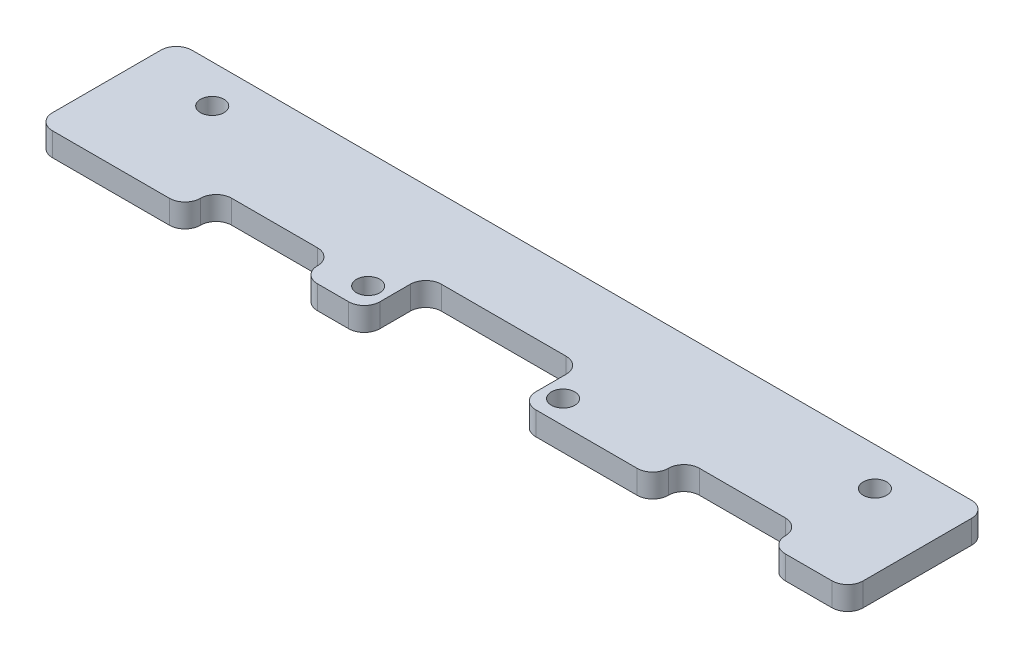
ISO-10303-21;
HEADER;
FILE_DESCRIPTION(('STEP AP214'),'2;1');
FILE_NAME('part.step','',(''),(''),'','','');
FILE_SCHEMA(('AUTOMOTIVE_DESIGN { 1 0 10303 214 1 1 1 1 }'));
ENDSEC;
DATA;
#1=APPLICATION_CONTEXT('core data for automotive mechanical design processes');
#2=APPLICATION_PROTOCOL_DEFINITION('international standard','automotive_design',2000,#1);
#3=PRODUCT_CONTEXT('',#1,'mechanical');
#4=PRODUCT('Part','Part','',(#3));
#5=PRODUCT_RELATED_PRODUCT_CATEGORY('part','',(#4));
#6=PRODUCT_DEFINITION_FORMATION('','',#4);
#7=PRODUCT_DEFINITION_CONTEXT('part definition',#1,'design');
#8=PRODUCT_DEFINITION('design','',#6,#7);
#9=PRODUCT_DEFINITION_SHAPE('','',#8);
#10=(LENGTH_UNIT() NAMED_UNIT(*) SI_UNIT(.MILLI.,.METRE.));
#11=(NAMED_UNIT(*) PLANE_ANGLE_UNIT() SI_UNIT($,.RADIAN.));
#12=(NAMED_UNIT(*) SI_UNIT($,.STERADIAN.) SOLID_ANGLE_UNIT());
#13=UNCERTAINTY_MEASURE_WITH_UNIT(LENGTH_MEASURE(1.E-05),#10,'distance_accuracy_value','');
#14=(GEOMETRIC_REPRESENTATION_CONTEXT(3) GLOBAL_UNCERTAINTY_ASSIGNED_CONTEXT((#13)) GLOBAL_UNIT_ASSIGNED_CONTEXT((#10,
#11,#12)) REPRESENTATION_CONTEXT('',''));
#15=CARTESIAN_POINT('',(0.,0.,0.));
#16=DIRECTION('',(0.,0.,1.));
#17=DIRECTION('',(1.,0.,0.));
#18=AXIS2_PLACEMENT_3D('',#15,#16,#17);
#19=CARTESIAN_POINT('',(-52.,3.,17.9));
#20=DIRECTION('',(0.,0.,-1.));
#21=DIRECTION('',(-1.,0.,0.));
#22=AXIS2_PLACEMENT_3D('',#19,#20,#21);
#23=PLANE('',#22);
#24=DIRECTION('',(1.,0.,0.));
#25=VECTOR('',#24,1.);
#26=CARTESIAN_POINT('',(-52.,0.,17.9));
#27=LINE('',#26,#25);
#28=CARTESIAN_POINT('',(-50.,0.,17.9));
#29=VERTEX_POINT('',#28);
#30=CARTESIAN_POINT('',(-35.,0.,17.9));
#31=VERTEX_POINT('',#30);
#32=EDGE_CURVE('E328',#29,#31,#27,.T.);
#33=ORIENTED_EDGE('',*,*,#32,.T.);
#34=DIRECTION('',(0.,1.,0.));
#35=VECTOR('',#34,1.);
#36=CARTESIAN_POINT('',(-35.,3.,17.9));
#37=LINE('',#36,#35);
#38=CARTESIAN_POINT('',(-35.,3.,17.9));
#39=VERTEX_POINT('',#38);
#40=EDGE_CURVE('E404',#31,#39,#37,.T.);
#41=ORIENTED_EDGE('',*,*,#40,.T.);
#42=DIRECTION('',(1.,0.,0.));
#43=VECTOR('',#42,1.);
#44=CARTESIAN_POINT('',(-52.,3.,17.9));
#45=LINE('',#44,#43);
#46=CARTESIAN_POINT('',(-50.,3.,17.9));
#47=VERTEX_POINT('',#46);
#48=EDGE_CURVE('E306',#47,#39,#45,.T.);
#49=ORIENTED_EDGE('',*,*,#48,.F.);
#50=DIRECTION('',(0.,-1.,0.));
#51=VECTOR('',#50,1.);
#52=CARTESIAN_POINT('',(-50.,3.,17.9));
#53=LINE('',#52,#51);
#54=EDGE_CURVE('E401',#47,#29,#53,.T.);
#55=ORIENTED_EDGE('',*,*,#54,.T.);
#56=EDGE_LOOP('',(#33,#41,#49,#55));
#57=FACE_BOUND('',#56,.T.);
#58=ADVANCED_FACE('F44',(#57),#23,.F.);
#59=CARTESIAN_POINT('',(52.,3.,17.9));
#60=DIRECTION('',(0.,0.,-1.));
#61=DIRECTION('',(-1.,0.,0.));
#62=AXIS2_PLACEMENT_3D('',#59,#60,#61);
#63=PLANE('',#62);
#64=DIRECTION('',(1.,0.,0.));
#65=VECTOR('',#64,1.);
#66=CARTESIAN_POINT('',(52.,0.,17.9));
#67=LINE('',#66,#65);
#68=CARTESIAN_POINT('',(12.,0.,17.9));
#69=VERTEX_POINT('',#68);
#70=CARTESIAN_POINT('',(25.,0.,17.9));
#71=VERTEX_POINT('',#70);
#72=EDGE_CURVE('E297',#69,#71,#67,.T.);
#73=ORIENTED_EDGE('',*,*,#72,.T.);
#74=DIRECTION('',(0.,1.,0.));
#75=VECTOR('',#74,1.);
#76=CARTESIAN_POINT('',(25.,3.,17.9));
#77=LINE('',#76,#75);
#78=CARTESIAN_POINT('',(25.,3.,17.9));
#79=VERTEX_POINT('',#78);
#80=EDGE_CURVE('E389',#71,#79,#77,.T.);
#81=ORIENTED_EDGE('',*,*,#80,.T.);
#82=DIRECTION('',(1.,0.,0.));
#83=VECTOR('',#82,1.);
#84=CARTESIAN_POINT('',(52.,3.,17.9));
#85=LINE('',#84,#83);
#86=CARTESIAN_POINT('',(12.,3.,17.9));
#87=VERTEX_POINT('',#86);
#88=EDGE_CURVE('E252',#87,#79,#85,.T.);
#89=ORIENTED_EDGE('',*,*,#88,.F.);
#90=DIRECTION('',(0.,-1.,0.));
#91=VECTOR('',#90,1.);
#92=CARTESIAN_POINT('',(12.,3.,17.9));
#93=LINE('',#92,#91);
#94=EDGE_CURVE('E386',#87,#69,#93,.T.);
#95=ORIENTED_EDGE('',*,*,#94,.T.);
#96=EDGE_LOOP('',(#73,#81,#89,#95));
#97=FACE_BOUND('',#96,.T.);
#98=ADVANCED_FACE('F532',(#97),#63,.F.);
#99=CARTESIAN_POINT('',(0.,3.,0.));
#100=DIRECTION('',(0.,-1.,0.));
#101=DIRECTION('',(0.,0.,-1.));
#102=AXIS2_PLACEMENT_3D('',#99,#100,#101);
#103=PLANE('',#102);
#104=DIRECTION('',(-1.,0.,0.));
#105=VECTOR('',#104,1.);
#106=CARTESIAN_POINT('',(-33.,3.,13.9));
#107=LINE('',#106,#105);
#108=CARTESIAN_POINT('',(-20.,3.,13.9));
#109=VERTEX_POINT('',#108);
#110=CARTESIAN_POINT('',(-31.,3.,13.9));
#111=VERTEX_POINT('',#110);
#112=EDGE_CURVE('E247',#109,#111,#107,.T.);
#113=ORIENTED_EDGE('',*,*,#112,.F.);
#114=CARTESIAN_POINT('',(-20.,3.,15.9));
#115=DIRECTION('',(0.,-1.,0.));
#116=DIRECTION('',(0.,0.,-1.));
#117=AXIS2_PLACEMENT_3D('',#114,#115,#116);
#118=CIRCLE('',#117,2.);
#119=CARTESIAN_POINT('',(-18.,3.,15.9));
#120=VERTEX_POINT('',#119);
#121=EDGE_CURVE('E230',#109,#120,#118,.T.);
#122=ORIENTED_EDGE('',*,*,#121,.T.);
#123=CARTESIAN_POINT('',(-16.,3.,15.9));
#124=DIRECTION('',(0.,-1.,0.));
#125=DIRECTION('',(0.,0.,-1.));
#126=AXIS2_PLACEMENT_3D('',#123,#124,#125);
#127=CIRCLE('',#126,2.);
#128=CARTESIAN_POINT('',(-16.,3.,17.9));
#129=VERTEX_POINT('',#128);
#130=EDGE_CURVE('E361',#120,#129,#127,.F.);
#131=ORIENTED_EDGE('',*,*,#130,.T.);
#132=CARTESIAN_POINT('',(-12.,3.,17.9));
#133=VERTEX_POINT('',#132);
#134=EDGE_CURVE('E303',#129,#133,#45,.T.);
#135=ORIENTED_EDGE('',*,*,#134,.T.);
#136=CARTESIAN_POINT('',(-12.,3.,15.9));
#137=DIRECTION('',(0.,-1.,0.));
#138=DIRECTION('',(0.,0.,-1.));
#139=AXIS2_PLACEMENT_3D('',#136,#137,#138);
#140=CIRCLE('',#139,2.);
#141=CARTESIAN_POINT('',(-10.,3.,15.9));
#142=VERTEX_POINT('',#141);
#143=EDGE_CURVE('E349',#133,#142,#140,.F.);
#144=ORIENTED_EDGE('',*,*,#143,.T.);
#145=DIRECTION('',(0.,0.,-1.));
#146=VECTOR('',#145,1.);
#147=CARTESIAN_POINT('',(-10.,3.,17.9));
#148=LINE('',#147,#146);
#149=CARTESIAN_POINT('',(-10.,3.,12.));
#150=VERTEX_POINT('',#149);
#151=EDGE_CURVE('E307',#142,#150,#148,.T.);
#152=ORIENTED_EDGE('',*,*,#151,.T.);
#153=CARTESIAN_POINT('',(-8.,3.,12.));
#154=DIRECTION('',(0.,-1.,0.));
#155=DIRECTION('',(0.,0.,-1.));
#156=AXIS2_PLACEMENT_3D('',#153,#154,#155);
#157=CIRCLE('',#156,2.);
#158=CARTESIAN_POINT('',(-8.,3.,10.));
#159=VERTEX_POINT('',#158);
#160=EDGE_CURVE('E11',#150,#159,#157,.T.);
#161=ORIENTED_EDGE('',*,*,#160,.T.);
#162=DIRECTION('',(1.,0.,0.));
#163=VECTOR('',#162,1.);
#164=CARTESIAN_POINT('',(10.,3.,10.));
#165=LINE('',#164,#163);
#166=CARTESIAN_POINT('',(8.,3.,10.));
#167=VERTEX_POINT('',#166);
#168=EDGE_CURVE('E310',#159,#167,#165,.T.);
#169=ORIENTED_EDGE('',*,*,#168,.T.);
#170=CARTESIAN_POINT('',(8.,3.,12.));
#171=DIRECTION('',(0.,-1.,0.));
#172=DIRECTION('',(0.,0.,-1.));
#173=AXIS2_PLACEMENT_3D('',#170,#171,#172);
#174=CIRCLE('',#173,2.);
#175=CARTESIAN_POINT('',(10.,3.,12.));
#176=VERTEX_POINT('',#175);
#177=EDGE_CURVE('E449',#167,#176,#174,.T.);
#178=ORIENTED_EDGE('',*,*,#177,.T.);
#179=DIRECTION('',(0.,0.,1.));
#180=VECTOR('',#179,1.);
#181=CARTESIAN_POINT('',(10.,3.,17.9));
#182=LINE('',#181,#180);
#183=CARTESIAN_POINT('',(10.,3.,15.9));
#184=VERTEX_POINT('',#183);
#185=EDGE_CURVE('E313',#176,#184,#182,.T.);
#186=ORIENTED_EDGE('',*,*,#185,.T.);
#187=CARTESIAN_POINT('',(12.,3.,15.9));
#188=DIRECTION('',(0.,-1.,0.));
#189=DIRECTION('',(0.,0.,-1.));
#190=AXIS2_PLACEMENT_3D('',#187,#188,#189);
#191=CIRCLE('',#190,2.);
#192=EDGE_CURVE('E351',#184,#87,#191,.F.);
#193=ORIENTED_EDGE('',*,*,#192,.T.);
#194=ORIENTED_EDGE('',*,*,#88,.T.);
#195=CARTESIAN_POINT('',(25.,3.,15.9));
#196=DIRECTION('',(0.,-1.,0.));
#197=DIRECTION('',(0.,0.,-1.));
#198=AXIS2_PLACEMENT_3D('',#195,#196,#197);
#199=CIRCLE('',#198,2.);
#200=CARTESIAN_POINT('',(27.,3.,15.9));
#201=VERTEX_POINT('',#200);
#202=EDGE_CURVE('E359',#79,#201,#199,.F.);
#203=ORIENTED_EDGE('',*,*,#202,.T.);
#204=CARTESIAN_POINT('',(29.,3.,15.9));
#205=DIRECTION('',(0.,-1.,0.));
#206=DIRECTION('',(0.,0.,-1.));
#207=AXIS2_PLACEMENT_3D('',#204,#205,#206);
#208=CIRCLE('',#207,2.);
#209=CARTESIAN_POINT('',(29.,3.,13.9));
#210=VERTEX_POINT('',#209);
#211=EDGE_CURVE('E439',#201,#210,#208,.T.);
#212=ORIENTED_EDGE('',*,*,#211,.T.);
#213=DIRECTION('',(-1.,0.,0.));
#214=VECTOR('',#213,1.);
#215=CARTESIAN_POINT('',(42.,3.,13.9));
#216=LINE('',#215,#214);
#217=CARTESIAN_POINT('',(40.,3.,13.9));
#218=VERTEX_POINT('',#217);
#219=EDGE_CURVE('E258',#218,#210,#216,.T.);
#220=ORIENTED_EDGE('',*,*,#219,.F.);
#221=CARTESIAN_POINT('',(40.,3.,15.9));
#222=DIRECTION('',(0.,-1.,0.));
#223=DIRECTION('',(0.,0.,-1.));
#224=AXIS2_PLACEMENT_3D('',#221,#222,#223);
#225=CIRCLE('',#224,2.);
#226=CARTESIAN_POINT('',(42.,3.,15.9));
#227=VERTEX_POINT('',#226);
#228=EDGE_CURVE('E443',#218,#227,#225,.T.);
#229=ORIENTED_EDGE('',*,*,#228,.T.);
#230=CARTESIAN_POINT('',(44.,3.,15.9));
#231=DIRECTION('',(0.,-1.,0.));
#232=DIRECTION('',(0.,0.,-1.));
#233=AXIS2_PLACEMENT_3D('',#230,#231,#232);
#234=CIRCLE('',#233,2.);
#235=CARTESIAN_POINT('',(44.,3.,17.9));
#236=VERTEX_POINT('',#235);
#237=EDGE_CURVE('E357',#227,#236,#234,.F.);
#238=ORIENTED_EDGE('',*,*,#237,.T.);
#239=CARTESIAN_POINT('',(50.,3.,17.9));
#240=VERTEX_POINT('',#239);
#241=EDGE_CURVE('E316',#236,#240,#85,.T.);
#242=ORIENTED_EDGE('',*,*,#241,.T.);
#243=CARTESIAN_POINT('',(50.,3.,15.9));
#244=DIRECTION('',(0.,-1.,0.));
#245=DIRECTION('',(0.,0.,-1.));
#246=AXIS2_PLACEMENT_3D('',#243,#244,#245);
#247=CIRCLE('',#246,2.);
#248=CARTESIAN_POINT('',(52.,3.,15.9));
#249=VERTEX_POINT('',#248);
#250=EDGE_CURVE('E353',#240,#249,#247,.F.);
#251=ORIENTED_EDGE('',*,*,#250,.T.);
#252=DIRECTION('',(0.,0.,-1.));
#253=VECTOR('',#252,1.);
#254=CARTESIAN_POINT('',(52.,3.,0.));
#255=LINE('',#254,#253);
#256=CARTESIAN_POINT('',(52.,3.,2.));
#257=VERTEX_POINT('',#256);
#258=EDGE_CURVE('E293',#249,#257,#255,.T.);
#259=ORIENTED_EDGE('',*,*,#258,.T.);
#260=CARTESIAN_POINT('',(50.,3.,2.));
#261=DIRECTION('',(0.,-1.,0.));
#262=DIRECTION('',(0.,0.,-1.));
#263=AXIS2_PLACEMENT_3D('',#260,#261,#262);
#264=CIRCLE('',#263,2.);
#265=CARTESIAN_POINT('',(50.,3.,0.));
#266=VERTEX_POINT('',#265);
#267=EDGE_CURVE('E345',#257,#266,#264,.F.);
#268=ORIENTED_EDGE('',*,*,#267,.T.);
#269=DIRECTION('',(-1.,0.,0.));
#270=VECTOR('',#269,1.);
#271=CARTESIAN_POINT('',(-52.,3.,0.));
#272=LINE('',#271,#270);
#273=CARTESIAN_POINT('',(-50.,3.,0.));
#274=VERTEX_POINT('',#273);
#275=EDGE_CURVE('E296',#266,#274,#272,.T.);
#276=ORIENTED_EDGE('',*,*,#275,.T.);
#277=CARTESIAN_POINT('',(-50.,3.,2.));
#278=DIRECTION('',(0.,-1.,0.));
#279=DIRECTION('',(0.,0.,-1.));
#280=AXIS2_PLACEMENT_3D('',#277,#278,#279);
#281=CIRCLE('',#280,2.);
#282=CARTESIAN_POINT('',(-52.,3.,2.));
#283=VERTEX_POINT('',#282);
#284=EDGE_CURVE('E343',#274,#283,#281,.F.);
#285=ORIENTED_EDGE('',*,*,#284,.T.);
#286=DIRECTION('',(0.,0.,1.));
#287=VECTOR('',#286,1.);
#288=CARTESIAN_POINT('',(-52.,3.,0.));
#289=LINE('',#288,#287);
#290=CARTESIAN_POINT('',(-52.,3.,15.9));
#291=VERTEX_POINT('',#290);
#292=EDGE_CURVE('E300',#283,#291,#289,.T.);
#293=ORIENTED_EDGE('',*,*,#292,.T.);
#294=CARTESIAN_POINT('',(-50.,3.,15.9));
#295=DIRECTION('',(0.,-1.,0.));
#296=DIRECTION('',(0.,0.,-1.));
#297=AXIS2_PLACEMENT_3D('',#294,#295,#296);
#298=CIRCLE('',#297,2.);
#299=EDGE_CURVE('E347',#291,#47,#298,.F.);
#300=ORIENTED_EDGE('',*,*,#299,.T.);
#301=ORIENTED_EDGE('',*,*,#48,.T.);
#302=CARTESIAN_POINT('',(-35.,3.,15.9));
#303=DIRECTION('',(0.,-1.,0.));
#304=DIRECTION('',(0.,0.,-1.));
#305=AXIS2_PLACEMENT_3D('',#302,#303,#304);
#306=CIRCLE('',#305,2.);
#307=CARTESIAN_POINT('',(-33.,3.,15.9));
#308=VERTEX_POINT('',#307);
#309=EDGE_CURVE('E355',#39,#308,#306,.F.);
#310=ORIENTED_EDGE('',*,*,#309,.T.);
#311=CARTESIAN_POINT('',(-31.,3.,15.9));
#312=DIRECTION('',(0.,-1.,0.));
#313=DIRECTION('',(0.,0.,-1.));
#314=AXIS2_PLACEMENT_3D('',#311,#312,#313);
#315=CIRCLE('',#314,2.);
#316=EDGE_CURVE('E257',#308,#111,#315,.T.);
#317=ORIENTED_EDGE('',*,*,#316,.T.);
#318=EDGE_LOOP('',(#113,#122,#131,#135,#144,#152,#161,#169,#178,#186,#193,#194,#203,#212,#220,
#229,#238,#242,#251,#259,#268,#276,#285,#293,#300,#301,#310,#317));
#319=FACE_BOUND('',#318,.T.);
#320=CARTESIAN_POINT('',(-12.5,3.,14.9));
#321=DIRECTION('',(0.,1.,0.));
#322=DIRECTION('',(0.,0.,1.));
#323=AXIS2_PLACEMENT_3D('',#320,#321,#322);
#324=CIRCLE('',#323,1.5);
#325=CARTESIAN_POINT('',(-12.5,3.,16.4));
#326=VERTEX_POINT('',#325);
#327=EDGE_CURVE('E287',#326,#326,#324,.T.);
#328=ORIENTED_EDGE('',*,*,#327,.F.);
#329=EDGE_LOOP('',(#328));
#330=FACE_BOUND('',#329,.T.);
#331=CARTESIAN_POINT('',(12.5,3.,14.9));
#332=DIRECTION('',(0.,1.,0.));
#333=DIRECTION('',(0.,0.,-1.));
#334=AXIS2_PLACEMENT_3D('',#331,#332,#333);
#335=CIRCLE('',#334,1.5);
#336=CARTESIAN_POINT('',(12.5,3.,13.4));
#337=VERTEX_POINT('',#336);
#338=EDGE_CURVE('E281',#337,#337,#335,.T.);
#339=ORIENTED_EDGE('',*,*,#338,.F.);
#340=EDGE_LOOP('',(#339));
#341=FACE_BOUND('',#340,.T.);
#342=CARTESIAN_POINT('',(-42.5,3.,4.9));
#343=DIRECTION('',(0.,1.,0.));
#344=DIRECTION('',(0.,0.,1.));
#345=AXIS2_PLACEMENT_3D('',#342,#343,#344);
#346=CIRCLE('',#345,1.5);
#347=CARTESIAN_POINT('',(-42.5,3.,6.4));
#348=VERTEX_POINT('',#347);
#349=EDGE_CURVE('E275',#348,#348,#346,.T.);
#350=ORIENTED_EDGE('',*,*,#349,.F.);
#351=EDGE_LOOP('',(#350));
#352=FACE_BOUND('',#351,.T.);
#353=CARTESIAN_POINT('',(42.5,3.,4.9));
#354=DIRECTION('',(0.,1.,0.));
#355=DIRECTION('',(0.,0.,-1.));
#356=AXIS2_PLACEMENT_3D('',#353,#354,#355);
#357=CIRCLE('',#356,1.5);
#358=CARTESIAN_POINT('',(42.5,3.,3.4));
#359=VERTEX_POINT('',#358);
#360=EDGE_CURVE('E269',#359,#359,#357,.T.);
#361=ORIENTED_EDGE('',*,*,#360,.F.);
#362=EDGE_LOOP('',(#361));
#363=FACE_BOUND('',#362,.T.);
#364=ADVANCED_FACE('F254',(#319,#330,#341,#352,#363),#103,.F.);
#365=CARTESIAN_POINT('',(0.,0.,0.));
#366=DIRECTION('',(0.,-1.,0.));
#367=DIRECTION('',(0.,0.,-1.));
#368=AXIS2_PLACEMENT_3D('',#365,#366,#367);
#369=PLANE('',#368);
#370=CARTESIAN_POINT('',(-16.,0.,17.9));
#371=VERTEX_POINT('',#370);
#372=CARTESIAN_POINT('',(-12.,0.,17.9));
#373=VERTEX_POINT('',#372);
#374=EDGE_CURVE('E327',#371,#373,#27,.T.);
#375=ORIENTED_EDGE('',*,*,#374,.F.);
#376=CARTESIAN_POINT('',(-16.,0.,15.9));
#377=DIRECTION('',(0.,-1.,0.));
#378=DIRECTION('',(0.,0.,-1.));
#379=AXIS2_PLACEMENT_3D('',#376,#377,#378);
#380=CIRCLE('',#379,2.);
#381=CARTESIAN_POINT('',(-18.,0.,15.9));
#382=VERTEX_POINT('',#381);
#383=EDGE_CURVE('E61',#371,#382,#380,.T.);
#384=ORIENTED_EDGE('',*,*,#383,.T.);
#385=CARTESIAN_POINT('',(-20.,0.,15.9));
#386=DIRECTION('',(0.,-1.,0.));
#387=DIRECTION('',(0.,0.,-1.));
#388=AXIS2_PLACEMENT_3D('',#385,#386,#387);
#389=CIRCLE('',#388,2.);
#390=CARTESIAN_POINT('',(-20.,0.,13.9));
#391=VERTEX_POINT('',#390);
#392=EDGE_CURVE('E239',#382,#391,#389,.F.);
#393=ORIENTED_EDGE('',*,*,#392,.T.);
#394=DIRECTION('',(-1.,0.,0.));
#395=VECTOR('',#394,1.);
#396=CARTESIAN_POINT('',(-33.,0.,13.9));
#397=LINE('',#396,#395);
#398=CARTESIAN_POINT('',(-31.,0.,13.9));
#399=VERTEX_POINT('',#398);
#400=EDGE_CURVE('E250',#391,#399,#397,.T.);
#401=ORIENTED_EDGE('',*,*,#400,.T.);
#402=CARTESIAN_POINT('',(-31.,0.,15.9));
#403=DIRECTION('',(0.,-1.,0.));
#404=DIRECTION('',(0.,0.,-1.));
#405=AXIS2_PLACEMENT_3D('',#402,#403,#404);
#406=CIRCLE('',#405,2.);
#407=CARTESIAN_POINT('',(-33.,0.,15.9));
#408=VERTEX_POINT('',#407);
#409=EDGE_CURVE('E240',#399,#408,#406,.F.);
#410=ORIENTED_EDGE('',*,*,#409,.T.);
#411=CARTESIAN_POINT('',(-35.,0.,15.9));
#412=DIRECTION('',(0.,-1.,0.));
#413=DIRECTION('',(0.,0.,-1.));
#414=AXIS2_PLACEMENT_3D('',#411,#412,#413);
#415=CIRCLE('',#414,2.);
#416=EDGE_CURVE('E379',#408,#31,#415,.T.);
#417=ORIENTED_EDGE('',*,*,#416,.T.);
#418=ORIENTED_EDGE('',*,*,#32,.F.);
#419=CARTESIAN_POINT('',(-50.,0.,15.9));
#420=DIRECTION('',(0.,-1.,0.));
#421=DIRECTION('',(0.,0.,-1.));
#422=AXIS2_PLACEMENT_3D('',#419,#420,#421);
#423=CIRCLE('',#422,2.);
#424=CARTESIAN_POINT('',(-52.,0.,15.9));
#425=VERTEX_POINT('',#424);
#426=EDGE_CURVE('E371',#29,#425,#423,.T.);
#427=ORIENTED_EDGE('',*,*,#426,.T.);
#428=DIRECTION('',(0.,0.,1.));
#429=VECTOR('',#428,1.);
#430=CARTESIAN_POINT('',(-52.,0.,0.));
#431=LINE('',#430,#429);
#432=CARTESIAN_POINT('',(-52.,0.,2.));
#433=VERTEX_POINT('',#432);
#434=EDGE_CURVE('E324',#433,#425,#431,.T.);
#435=ORIENTED_EDGE('',*,*,#434,.F.);
#436=CARTESIAN_POINT('',(-50.,0.,2.));
#437=DIRECTION('',(0.,-1.,0.));
#438=DIRECTION('',(0.,0.,-1.));
#439=AXIS2_PLACEMENT_3D('',#436,#437,#438);
#440=CIRCLE('',#439,2.);
#441=CARTESIAN_POINT('',(-50.,0.,0.));
#442=VERTEX_POINT('',#441);
#443=EDGE_CURVE('E367',#433,#442,#440,.T.);
#444=ORIENTED_EDGE('',*,*,#443,.T.);
#445=DIRECTION('',(-1.,0.,0.));
#446=VECTOR('',#445,1.);
#447=CARTESIAN_POINT('',(-52.,0.,0.));
#448=LINE('',#447,#446);
#449=CARTESIAN_POINT('',(50.,0.,0.));
#450=VERTEX_POINT('',#449);
#451=EDGE_CURVE('E321',#450,#442,#448,.T.);
#452=ORIENTED_EDGE('',*,*,#451,.F.);
#453=CARTESIAN_POINT('',(50.,0.,2.));
#454=DIRECTION('',(0.,-1.,0.));
#455=DIRECTION('',(0.,0.,-1.));
#456=AXIS2_PLACEMENT_3D('',#453,#454,#455);
#457=CIRCLE('',#456,2.);
#458=CARTESIAN_POINT('',(52.,0.,2.));
#459=VERTEX_POINT('',#458);
#460=EDGE_CURVE('E369',#450,#459,#457,.T.);
#461=ORIENTED_EDGE('',*,*,#460,.T.);
#462=DIRECTION('',(0.,0.,-1.));
#463=VECTOR('',#462,1.);
#464=CARTESIAN_POINT('',(52.,0.,0.));
#465=LINE('',#464,#463);
#466=CARTESIAN_POINT('',(52.,0.,15.9));
#467=VERTEX_POINT('',#466);
#468=EDGE_CURVE('E290',#467,#459,#465,.T.);
#469=ORIENTED_EDGE('',*,*,#468,.F.);
#470=CARTESIAN_POINT('',(50.,0.,15.9));
#471=DIRECTION('',(0.,-1.,0.));
#472=DIRECTION('',(0.,0.,-1.));
#473=AXIS2_PLACEMENT_3D('',#470,#471,#472);
#474=CIRCLE('',#473,2.);
#475=CARTESIAN_POINT('',(50.,0.,17.9));
#476=VERTEX_POINT('',#475);
#477=EDGE_CURVE('E377',#467,#476,#474,.T.);
#478=ORIENTED_EDGE('',*,*,#477,.T.);
#479=CARTESIAN_POINT('',(44.,0.,17.9));
#480=VERTEX_POINT('',#479);
#481=EDGE_CURVE('E339',#480,#476,#67,.T.);
#482=ORIENTED_EDGE('',*,*,#481,.F.);
#483=CARTESIAN_POINT('',(44.,0.,15.9));
#484=DIRECTION('',(0.,-1.,0.));
#485=DIRECTION('',(0.,0.,-1.));
#486=AXIS2_PLACEMENT_3D('',#483,#484,#485);
#487=CIRCLE('',#486,2.);
#488=CARTESIAN_POINT('',(42.,0.,15.9));
#489=VERTEX_POINT('',#488);
#490=EDGE_CURVE('E381',#480,#489,#487,.T.);
#491=ORIENTED_EDGE('',*,*,#490,.T.);
#492=CARTESIAN_POINT('',(40.,0.,15.9));
#493=DIRECTION('',(0.,-1.,0.));
#494=DIRECTION('',(0.,0.,-1.));
#495=AXIS2_PLACEMENT_3D('',#492,#493,#494);
#496=CIRCLE('',#495,2.);
#497=CARTESIAN_POINT('',(40.,0.,13.9));
#498=VERTEX_POINT('',#497);
#499=EDGE_CURVE('E445',#489,#498,#496,.F.);
#500=ORIENTED_EDGE('',*,*,#499,.T.);
#501=DIRECTION('',(-1.,0.,0.));
#502=VECTOR('',#501,1.);
#503=CARTESIAN_POINT('',(42.,0.,13.9));
#504=LINE('',#503,#502);
#505=CARTESIAN_POINT('',(29.,0.,13.9));
#506=VERTEX_POINT('',#505);
#507=EDGE_CURVE('E263',#498,#506,#504,.T.);
#508=ORIENTED_EDGE('',*,*,#507,.T.);
#509=CARTESIAN_POINT('',(29.,0.,15.9));
#510=DIRECTION('',(0.,-1.,0.));
#511=DIRECTION('',(0.,0.,-1.));
#512=AXIS2_PLACEMENT_3D('',#509,#510,#511);
#513=CIRCLE('',#512,2.);
#514=CARTESIAN_POINT('',(27.,0.,15.9));
#515=VERTEX_POINT('',#514);
#516=EDGE_CURVE('E441',#506,#515,#513,.F.);
#517=ORIENTED_EDGE('',*,*,#516,.T.);
#518=CARTESIAN_POINT('',(25.,0.,15.9));
#519=DIRECTION('',(0.,-1.,0.));
#520=DIRECTION('',(0.,0.,-1.));
#521=AXIS2_PLACEMENT_3D('',#518,#519,#520);
#522=CIRCLE('',#521,2.);
#523=EDGE_CURVE('E383',#515,#71,#522,.T.);
#524=ORIENTED_EDGE('',*,*,#523,.T.);
#525=ORIENTED_EDGE('',*,*,#72,.F.);
#526=CARTESIAN_POINT('',(12.,0.,15.9));
#527=DIRECTION('',(0.,-1.,0.));
#528=DIRECTION('',(0.,0.,-1.));
#529=AXIS2_PLACEMENT_3D('',#526,#527,#528);
#530=CIRCLE('',#529,2.);
#531=CARTESIAN_POINT('',(10.,0.,15.9));
#532=VERTEX_POINT('',#531);
#533=EDGE_CURVE('E375',#69,#532,#530,.T.);
#534=ORIENTED_EDGE('',*,*,#533,.T.);
#535=DIRECTION('',(0.,0.,1.));
#536=VECTOR('',#535,1.);
#537=CARTESIAN_POINT('',(10.,0.,17.9));
#538=LINE('',#537,#536);
#539=CARTESIAN_POINT('',(10.,0.,12.));
#540=VERTEX_POINT('',#539);
#541=EDGE_CURVE('E336',#540,#532,#538,.T.);
#542=ORIENTED_EDGE('',*,*,#541,.F.);
#543=CARTESIAN_POINT('',(8.,0.,12.));
#544=DIRECTION('',(0.,-1.,0.));
#545=DIRECTION('',(0.,0.,-1.));
#546=AXIS2_PLACEMENT_3D('',#543,#544,#545);
#547=CIRCLE('',#546,2.);
#548=CARTESIAN_POINT('',(8.,0.,10.));
#549=VERTEX_POINT('',#548);
#550=EDGE_CURVE('E447',#540,#549,#547,.F.);
#551=ORIENTED_EDGE('',*,*,#550,.T.);
#552=DIRECTION('',(1.,0.,0.));
#553=VECTOR('',#552,1.);
#554=CARTESIAN_POINT('',(10.,0.,10.));
#555=LINE('',#554,#553);
#556=CARTESIAN_POINT('',(-8.,0.,10.));
#557=VERTEX_POINT('',#556);
#558=EDGE_CURVE('E333',#557,#549,#555,.T.);
#559=ORIENTED_EDGE('',*,*,#558,.F.);
#560=CARTESIAN_POINT('',(-8.,0.,12.));
#561=DIRECTION('',(0.,-1.,0.));
#562=DIRECTION('',(0.,0.,-1.));
#563=AXIS2_PLACEMENT_3D('',#560,#561,#562);
#564=CIRCLE('',#563,2.);
#565=CARTESIAN_POINT('',(-10.,0.,12.));
#566=VERTEX_POINT('',#565);
#567=EDGE_CURVE('E53',#557,#566,#564,.F.);
#568=ORIENTED_EDGE('',*,*,#567,.T.);
#569=DIRECTION('',(0.,0.,-1.));
#570=VECTOR('',#569,1.);
#571=CARTESIAN_POINT('',(-10.,0.,17.9));
#572=LINE('',#571,#570);
#573=CARTESIAN_POINT('',(-10.,0.,15.9));
#574=VERTEX_POINT('',#573);
#575=EDGE_CURVE('E331',#574,#566,#572,.T.);
#576=ORIENTED_EDGE('',*,*,#575,.F.);
#577=CARTESIAN_POINT('',(-12.,0.,15.9));
#578=DIRECTION('',(0.,-1.,0.));
#579=DIRECTION('',(0.,0.,-1.));
#580=AXIS2_PLACEMENT_3D('',#577,#578,#579);
#581=CIRCLE('',#580,2.);
#582=EDGE_CURVE('E373',#574,#373,#581,.T.);
#583=ORIENTED_EDGE('',*,*,#582,.T.);
#584=EDGE_LOOP('',(#375,#384,#393,#401,#410,#417,#418,#427,#435,#444,#452,#461,#469,#478,#482,
#491,#500,#508,#517,#524,#525,#534,#542,#551,#559,#568,#576,#583));
#585=FACE_BOUND('',#584,.T.);
#586=CARTESIAN_POINT('',(-42.5,0.,4.9));
#587=DIRECTION('',(0.,1.,0.));
#588=DIRECTION('',(0.,0.,1.));
#589=AXIS2_PLACEMENT_3D('',#586,#587,#588);
#590=CIRCLE('',#589,1.5);
#591=CARTESIAN_POINT('',(-42.5,0.,6.4));
#592=VERTEX_POINT('',#591);
#593=EDGE_CURVE('E272',#592,#592,#590,.T.);
#594=ORIENTED_EDGE('',*,*,#593,.T.);
#595=EDGE_LOOP('',(#594));
#596=FACE_BOUND('',#595,.T.);
#597=CARTESIAN_POINT('',(-12.5,0.,14.9));
#598=DIRECTION('',(0.,1.,0.));
#599=DIRECTION('',(0.,0.,1.));
#600=AXIS2_PLACEMENT_3D('',#597,#598,#599);
#601=CIRCLE('',#600,1.5);
#602=CARTESIAN_POINT('',(-12.5,0.,16.4));
#603=VERTEX_POINT('',#602);
#604=EDGE_CURVE('E284',#603,#603,#601,.T.);
#605=ORIENTED_EDGE('',*,*,#604,.T.);
#606=EDGE_LOOP('',(#605));
#607=FACE_BOUND('',#606,.T.);
#608=CARTESIAN_POINT('',(12.5,0.,14.9));
#609=DIRECTION('',(0.,1.,0.));
#610=DIRECTION('',(0.,0.,-1.));
#611=AXIS2_PLACEMENT_3D('',#608,#609,#610);
#612=CIRCLE('',#611,1.5);
#613=CARTESIAN_POINT('',(12.5,0.,13.4));
#614=VERTEX_POINT('',#613);
#615=EDGE_CURVE('E278',#614,#614,#612,.T.);
#616=ORIENTED_EDGE('',*,*,#615,.T.);
#617=EDGE_LOOP('',(#616));
#618=FACE_BOUND('',#617,.T.);
#619=CARTESIAN_POINT('',(42.5,0.,4.9));
#620=DIRECTION('',(0.,1.,0.));
#621=DIRECTION('',(0.,0.,-1.));
#622=AXIS2_PLACEMENT_3D('',#619,#620,#621);
#623=CIRCLE('',#622,1.5);
#624=CARTESIAN_POINT('',(42.5,0.,3.4));
#625=VERTEX_POINT('',#624);
#626=EDGE_CURVE('E260',#625,#625,#623,.T.);
#627=ORIENTED_EDGE('',*,*,#626,.T.);
#628=EDGE_LOOP('',(#627));
#629=FACE_BOUND('',#628,.T.);
#630=ADVANCED_FACE('F519',(#585,#596,#607,#618,#629),#369,.T.);
#631=CARTESIAN_POINT('',(52.,3.,0.));
#632=DIRECTION('',(-1.,0.,0.));
#633=DIRECTION('',(0.,0.,1.));
#634=AXIS2_PLACEMENT_3D('',#631,#632,#633);
#635=PLANE('',#634);
#636=ORIENTED_EDGE('',*,*,#258,.F.);
#637=DIRECTION('',(0.,-1.,0.));
#638=VECTOR('',#637,1.);
#639=CARTESIAN_POINT('',(52.,3.,15.9));
#640=LINE('',#639,#638);
#641=EDGE_CURVE('E408',#249,#467,#640,.T.);
#642=ORIENTED_EDGE('',*,*,#641,.T.);
#643=ORIENTED_EDGE('',*,*,#468,.T.);
#644=DIRECTION('',(0.,-1.,0.));
#645=VECTOR('',#644,1.);
#646=CARTESIAN_POINT('',(52.,3.,2.));
#647=LINE('',#646,#645);
#648=EDGE_CURVE('E406',#459,#257,#647,.F.);
#649=ORIENTED_EDGE('',*,*,#648,.T.);
#650=EDGE_LOOP('',(#636,#642,#643,#649));
#651=FACE_BOUND('',#650,.T.);
#652=ADVANCED_FACE('F484',(#651),#635,.F.);
#653=CARTESIAN_POINT('',(-52.,3.,0.));
#654=DIRECTION('',(0.,0.,1.));
#655=DIRECTION('',(1.,0.,0.));
#656=AXIS2_PLACEMENT_3D('',#653,#654,#655);
#657=PLANE('',#656);
#658=ORIENTED_EDGE('',*,*,#275,.F.);
#659=DIRECTION('',(0.,-1.,0.));
#660=VECTOR('',#659,1.);
#661=CARTESIAN_POINT('',(50.,3.,0.));
#662=LINE('',#661,#660);
#663=EDGE_CURVE('E433',#266,#450,#662,.T.);
#664=ORIENTED_EDGE('',*,*,#663,.T.);
#665=ORIENTED_EDGE('',*,*,#451,.T.);
#666=DIRECTION('',(0.,-1.,0.));
#667=VECTOR('',#666,1.);
#668=CARTESIAN_POINT('',(-50.,3.,0.));
#669=LINE('',#668,#667);
#670=EDGE_CURVE('E431',#442,#274,#669,.F.);
#671=ORIENTED_EDGE('',*,*,#670,.T.);
#672=EDGE_LOOP('',(#658,#664,#665,#671));
#673=FACE_BOUND('',#672,.T.);
#674=ADVANCED_FACE('F493',(#673),#657,.F.);
#675=CARTESIAN_POINT('',(-52.,3.,0.));
#676=DIRECTION('',(1.,0.,0.));
#677=DIRECTION('',(0.,0.,-1.));
#678=AXIS2_PLACEMENT_3D('',#675,#676,#677);
#679=PLANE('',#678);
#680=ORIENTED_EDGE('',*,*,#434,.T.);
#681=DIRECTION('',(0.,-1.,0.));
#682=VECTOR('',#681,1.);
#683=CARTESIAN_POINT('',(-52.,3.,15.9));
#684=LINE('',#683,#682);
#685=EDGE_CURVE('E429',#425,#291,#684,.F.);
#686=ORIENTED_EDGE('',*,*,#685,.T.);
#687=ORIENTED_EDGE('',*,*,#292,.F.);
#688=DIRECTION('',(0.,-1.,0.));
#689=VECTOR('',#688,1.);
#690=CARTESIAN_POINT('',(-52.,3.,2.));
#691=LINE('',#690,#689);
#692=EDGE_CURVE('E426',#283,#433,#691,.T.);
#693=ORIENTED_EDGE('',*,*,#692,.T.);
#694=EDGE_LOOP('',(#680,#686,#687,#693));
#695=FACE_BOUND('',#694,.T.);
#696=ADVANCED_FACE('F501',(#695),#679,.F.);
#697=ORIENTED_EDGE('',*,*,#134,.F.);
#698=DIRECTION('',(0.,1.,0.));
#699=VECTOR('',#698,1.);
#700=CARTESIAN_POINT('',(-16.,3.,17.9));
#701=LINE('',#700,#699);
#702=EDGE_CURVE('E365',#129,#371,#701,.F.);
#703=ORIENTED_EDGE('',*,*,#702,.T.);
#704=ORIENTED_EDGE('',*,*,#374,.T.);
#705=DIRECTION('',(0.,-1.,0.));
#706=VECTOR('',#705,1.);
#707=CARTESIAN_POINT('',(-12.,3.,17.9));
#708=LINE('',#707,#706);
#709=EDGE_CURVE('E363',#373,#133,#708,.F.);
#710=ORIENTED_EDGE('',*,*,#709,.T.);
#711=EDGE_LOOP('',(#697,#703,#704,#710));
#712=FACE_BOUND('',#711,.T.);
#713=ADVANCED_FACE('F569',(#712),#23,.F.);
#714=CARTESIAN_POINT('',(-10.,3.,17.9));
#715=DIRECTION('',(-1.,0.,0.));
#716=DIRECTION('',(0.,0.,1.));
#717=AXIS2_PLACEMENT_3D('',#714,#715,#716);
#718=PLANE('',#717);
#719=ORIENTED_EDGE('',*,*,#575,.T.);
#720=DIRECTION('',(0.,-1.,0.));
#721=VECTOR('',#720,1.);
#722=CARTESIAN_POINT('',(-10.,3.,12.));
#723=LINE('',#722,#721);
#724=EDGE_CURVE('E424',#566,#150,#723,.F.);
#725=ORIENTED_EDGE('',*,*,#724,.T.);
#726=ORIENTED_EDGE('',*,*,#151,.F.);
#727=DIRECTION('',(0.,-1.,0.));
#728=VECTOR('',#727,1.);
#729=CARTESIAN_POINT('',(-10.,3.,15.9));
#730=LINE('',#729,#728);
#731=EDGE_CURVE('E421',#142,#574,#730,.T.);
#732=ORIENTED_EDGE('',*,*,#731,.T.);
#733=EDGE_LOOP('',(#719,#725,#726,#732));
#734=FACE_BOUND('',#733,.T.);
#735=ADVANCED_FACE('F560',(#734),#718,.F.);
#736=CARTESIAN_POINT('',(10.,3.,10.));
#737=DIRECTION('',(0.,0.,-1.));
#738=DIRECTION('',(-1.,0.,0.));
#739=AXIS2_PLACEMENT_3D('',#736,#737,#738);
#740=PLANE('',#739);
#741=ORIENTED_EDGE('',*,*,#558,.T.);
#742=DIRECTION('',(0.,-1.,0.));
#743=VECTOR('',#742,1.);
#744=CARTESIAN_POINT('',(8.,3.,10.));
#745=LINE('',#744,#743);
#746=EDGE_CURVE('E419',#549,#167,#745,.F.);
#747=ORIENTED_EDGE('',*,*,#746,.T.);
#748=ORIENTED_EDGE('',*,*,#168,.F.);
#749=DIRECTION('',(0.,-1.,0.));
#750=VECTOR('',#749,1.);
#751=CARTESIAN_POINT('',(-8.,0.,10.));
#752=LINE('',#751,#750);
#753=EDGE_CURVE('E416',#159,#557,#752,.T.);
#754=ORIENTED_EDGE('',*,*,#753,.T.);
#755=EDGE_LOOP('',(#741,#747,#748,#754));
#756=FACE_BOUND('',#755,.T.);
#757=ADVANCED_FACE('F551',(#756),#740,.F.);
#758=CARTESIAN_POINT('',(10.,3.,17.9));
#759=DIRECTION('',(1.,0.,0.));
#760=DIRECTION('',(0.,0.,-1.));
#761=AXIS2_PLACEMENT_3D('',#758,#759,#760);
#762=PLANE('',#761);
#763=ORIENTED_EDGE('',*,*,#541,.T.);
#764=DIRECTION('',(0.,-1.,0.));
#765=VECTOR('',#764,1.);
#766=CARTESIAN_POINT('',(10.,3.,15.9));
#767=LINE('',#766,#765);
#768=EDGE_CURVE('E414',#532,#184,#767,.F.);
#769=ORIENTED_EDGE('',*,*,#768,.T.);
#770=ORIENTED_EDGE('',*,*,#185,.F.);
#771=DIRECTION('',(0.,-1.,0.));
#772=VECTOR('',#771,1.);
#773=CARTESIAN_POINT('',(10.,0.,12.));
#774=LINE('',#773,#772);
#775=EDGE_CURVE('E411',#176,#540,#774,.T.);
#776=ORIENTED_EDGE('',*,*,#775,.T.);
#777=EDGE_LOOP('',(#763,#769,#770,#776));
#778=FACE_BOUND('',#777,.T.);
#779=ADVANCED_FACE('F543',(#778),#762,.F.);
#780=ORIENTED_EDGE('',*,*,#241,.F.);
#781=DIRECTION('',(0.,1.,0.));
#782=VECTOR('',#781,1.);
#783=CARTESIAN_POINT('',(44.,3.,17.9));
#784=LINE('',#783,#782);
#785=EDGE_CURVE('E399',#236,#480,#784,.F.);
#786=ORIENTED_EDGE('',*,*,#785,.T.);
#787=ORIENTED_EDGE('',*,*,#481,.T.);
#788=DIRECTION('',(0.,-1.,0.));
#789=VECTOR('',#788,1.);
#790=CARTESIAN_POINT('',(50.,3.,17.9));
#791=LINE('',#790,#789);
#792=EDGE_CURVE('E397',#476,#240,#791,.F.);
#793=ORIENTED_EDGE('',*,*,#792,.T.);
#794=EDGE_LOOP('',(#780,#786,#787,#793));
#795=FACE_BOUND('',#794,.T.);
#796=ADVANCED_FACE('F474',(#795),#63,.F.);
#797=CARTESIAN_POINT('',(-12.5,3.,14.9));
#798=DIRECTION('',(0.,-1.,0.));
#799=DIRECTION('',(0.,0.,-1.));
#800=AXIS2_PLACEMENT_3D('',#797,#798,#799);
#801=CYLINDRICAL_SURFACE('',#800,1.5);
#802=ORIENTED_EDGE('',*,*,#327,.T.);
#803=EDGE_LOOP('',(#802));
#804=FACE_BOUND('',#803,.T.);
#805=ORIENTED_EDGE('',*,*,#604,.F.);
#806=EDGE_LOOP('',(#805));
#807=FACE_BOUND('',#806,.T.);
#808=ADVANCED_FACE('F623',(#804,#807),#801,.F.);
#809=CARTESIAN_POINT('',(12.5,3.,14.9));
#810=DIRECTION('',(0.,-1.,0.));
#811=DIRECTION('',(0.,0.,-1.));
#812=AXIS2_PLACEMENT_3D('',#809,#810,#811);
#813=CYLINDRICAL_SURFACE('',#812,1.5);
#814=ORIENTED_EDGE('',*,*,#338,.T.);
#815=EDGE_LOOP('',(#814));
#816=FACE_BOUND('',#815,.T.);
#817=ORIENTED_EDGE('',*,*,#615,.F.);
#818=EDGE_LOOP('',(#817));
#819=FACE_BOUND('',#818,.T.);
#820=ADVANCED_FACE('F619',(#816,#819),#813,.F.);
#821=CARTESIAN_POINT('',(-42.5,3.,4.9));
#822=DIRECTION('',(0.,-1.,0.));
#823=DIRECTION('',(0.,0.,-1.));
#824=AXIS2_PLACEMENT_3D('',#821,#822,#823);
#825=CYLINDRICAL_SURFACE('',#824,1.5);
#826=ORIENTED_EDGE('',*,*,#349,.T.);
#827=EDGE_LOOP('',(#826));
#828=FACE_BOUND('',#827,.T.);
#829=ORIENTED_EDGE('',*,*,#593,.F.);
#830=EDGE_LOOP('',(#829));
#831=FACE_BOUND('',#830,.T.);
#832=ADVANCED_FACE('F615',(#828,#831),#825,.F.);
#833=CARTESIAN_POINT('',(42.5,3.,4.9));
#834=DIRECTION('',(0.,-1.,0.));
#835=DIRECTION('',(0.,0.,-1.));
#836=AXIS2_PLACEMENT_3D('',#833,#834,#835);
#837=CYLINDRICAL_SURFACE('',#836,1.5);
#838=ORIENTED_EDGE('',*,*,#360,.T.);
#839=EDGE_LOOP('',(#838));
#840=FACE_BOUND('',#839,.T.);
#841=ORIENTED_EDGE('',*,*,#626,.F.);
#842=EDGE_LOOP('',(#841));
#843=FACE_BOUND('',#842,.T.);
#844=ADVANCED_FACE('F610',(#840,#843),#837,.F.);
#845=CARTESIAN_POINT('',(42.,0.,13.9));
#846=DIRECTION('',(0.,0.,-1.));
#847=DIRECTION('',(-1.,0.,0.));
#848=AXIS2_PLACEMENT_3D('',#845,#846,#847);
#849=PLANE('',#848);
#850=ORIENTED_EDGE('',*,*,#219,.T.);
#851=DIRECTION('',(0.,1.,0.));
#852=VECTOR('',#851,1.);
#853=CARTESIAN_POINT('',(29.,0.,13.9));
#854=LINE('',#853,#852);
#855=EDGE_CURVE('E395',#210,#506,#854,.F.);
#856=ORIENTED_EDGE('',*,*,#855,.T.);
#857=ORIENTED_EDGE('',*,*,#507,.F.);
#858=DIRECTION('',(0.,1.,0.));
#859=VECTOR('',#858,1.);
#860=CARTESIAN_POINT('',(40.,3.,13.9));
#861=LINE('',#860,#859);
#862=EDGE_CURVE('E392',#498,#218,#861,.T.);
#863=ORIENTED_EDGE('',*,*,#862,.T.);
#864=EDGE_LOOP('',(#850,#856,#857,#863));
#865=FACE_BOUND('',#864,.T.);
#866=ADVANCED_FACE('F524',(#865),#849,.F.);
#867=CARTESIAN_POINT('',(-33.,0.,13.9));
#868=DIRECTION('',(0.,0.,-1.));
#869=DIRECTION('',(-1.,0.,0.));
#870=AXIS2_PLACEMENT_3D('',#867,#868,#869);
#871=PLANE('',#870);
#872=ORIENTED_EDGE('',*,*,#112,.T.);
#873=DIRECTION('',(0.,1.,0.));
#874=VECTOR('',#873,1.);
#875=CARTESIAN_POINT('',(-31.,0.,13.9));
#876=LINE('',#875,#874);
#877=EDGE_CURVE('E251',#111,#399,#876,.F.);
#878=ORIENTED_EDGE('',*,*,#877,.T.);
#879=ORIENTED_EDGE('',*,*,#400,.F.);
#880=DIRECTION('',(0.,1.,0.));
#881=VECTOR('',#880,1.);
#882=CARTESIAN_POINT('',(-20.,3.,13.9));
#883=LINE('',#882,#881);
#884=EDGE_CURVE('E234',#391,#109,#883,.T.);
#885=ORIENTED_EDGE('',*,*,#884,.T.);
#886=EDGE_LOOP('',(#872,#878,#879,#885));
#887=FACE_BOUND('',#886,.T.);
#888=ADVANCED_FACE('F245',(#887),#871,.F.);
#889=CARTESIAN_POINT('',(-35.,3.,15.9));
#890=DIRECTION('',(0.,1.,0.));
#891=DIRECTION('',(0.,0.,1.));
#892=AXIS2_PLACEMENT_3D('',#889,#890,#891);
#893=CYLINDRICAL_SURFACE('',#892,2.);
#894=ORIENTED_EDGE('',*,*,#40,.F.);
#895=ORIENTED_EDGE('',*,*,#416,.F.);
#896=DIRECTION('',(0.,1.,0.));
#897=VECTOR('',#896,1.);
#898=CARTESIAN_POINT('',(-33.,0.,15.9));
#899=LINE('',#898,#897);
#900=EDGE_CURVE('E268',#308,#408,#899,.F.);
#901=ORIENTED_EDGE('',*,*,#900,.F.);
#902=ORIENTED_EDGE('',*,*,#309,.F.);
#903=EDGE_LOOP('',(#894,#895,#901,#902));
#904=FACE_BOUND('',#903,.T.);
#905=ADVANCED_FACE('F515',(#904),#893,.T.);
#906=CARTESIAN_POINT('',(-31.,0.,15.9));
#907=DIRECTION('',(0.,-1.,0.));
#908=DIRECTION('',(0.,0.,-1.));
#909=AXIS2_PLACEMENT_3D('',#906,#907,#908);
#910=CYLINDRICAL_SURFACE('',#909,2.);
#911=ORIENTED_EDGE('',*,*,#409,.F.);
#912=ORIENTED_EDGE('',*,*,#877,.F.);
#913=ORIENTED_EDGE('',*,*,#316,.F.);
#914=ORIENTED_EDGE('',*,*,#900,.T.);
#915=EDGE_LOOP('',(#911,#912,#913,#914));
#916=FACE_BOUND('',#915,.T.);
#917=ADVANCED_FACE('F518',(#916),#910,.F.);
#918=CARTESIAN_POINT('',(-16.,0.,15.9));
#919=DIRECTION('',(0.,1.,0.));
#920=DIRECTION('',(0.,0.,1.));
#921=AXIS2_PLACEMENT_3D('',#918,#919,#920);
#922=CYLINDRICAL_SURFACE('',#921,2.);
#923=DIRECTION('',(0.,1.,0.));
#924=VECTOR('',#923,1.);
#925=CARTESIAN_POINT('',(-18.,0.,15.9));
#926=LINE('',#925,#924);
#927=EDGE_CURVE('E235',#382,#120,#926,.T.);
#928=ORIENTED_EDGE('',*,*,#927,.F.);
#929=ORIENTED_EDGE('',*,*,#383,.F.);
#930=ORIENTED_EDGE('',*,*,#702,.F.);
#931=ORIENTED_EDGE('',*,*,#130,.F.);
#932=EDGE_LOOP('',(#928,#929,#930,#931));
#933=FACE_BOUND('',#932,.T.);
#934=ADVANCED_FACE('F572',(#933),#922,.T.);
#935=CARTESIAN_POINT('',(-20.,0.,15.9));
#936=DIRECTION('',(0.,-1.,0.));
#937=DIRECTION('',(0.,0.,-1.));
#938=AXIS2_PLACEMENT_3D('',#935,#936,#937);
#939=CYLINDRICAL_SURFACE('',#938,2.);
#940=ORIENTED_EDGE('',*,*,#392,.F.);
#941=ORIENTED_EDGE('',*,*,#927,.T.);
#942=ORIENTED_EDGE('',*,*,#121,.F.);
#943=ORIENTED_EDGE('',*,*,#884,.F.);
#944=EDGE_LOOP('',(#940,#941,#942,#943));
#945=FACE_BOUND('',#944,.T.);
#946=ADVANCED_FACE('F233',(#945),#939,.F.);
#947=CARTESIAN_POINT('',(29.,0.,15.9));
#948=DIRECTION('',(0.,-1.,0.));
#949=DIRECTION('',(0.,0.,-1.));
#950=AXIS2_PLACEMENT_3D('',#947,#948,#949);
#951=CYLINDRICAL_SURFACE('',#950,2.);
#952=DIRECTION('',(0.,1.,0.));
#953=VECTOR('',#952,1.);
#954=CARTESIAN_POINT('',(27.,3.,15.9));
#955=LINE('',#954,#953);
#956=EDGE_CURVE('E454',#515,#201,#955,.T.);
#957=ORIENTED_EDGE('',*,*,#956,.F.);
#958=ORIENTED_EDGE('',*,*,#516,.F.);
#959=ORIENTED_EDGE('',*,*,#855,.F.);
#960=ORIENTED_EDGE('',*,*,#211,.F.);
#961=EDGE_LOOP('',(#957,#958,#959,#960));
#962=FACE_BOUND('',#961,.T.);
#963=ADVANCED_FACE('F528',(#962),#951,.F.);
#964=CARTESIAN_POINT('',(25.,3.,15.9));
#965=DIRECTION('',(0.,1.,0.));
#966=DIRECTION('',(0.,0.,1.));
#967=AXIS2_PLACEMENT_3D('',#964,#965,#966);
#968=CYLINDRICAL_SURFACE('',#967,2.);
#969=ORIENTED_EDGE('',*,*,#523,.F.);
#970=ORIENTED_EDGE('',*,*,#956,.T.);
#971=ORIENTED_EDGE('',*,*,#202,.F.);
#972=ORIENTED_EDGE('',*,*,#80,.F.);
#973=EDGE_LOOP('',(#969,#970,#971,#972));
#974=FACE_BOUND('',#973,.T.);
#975=ADVANCED_FACE('F536',(#974),#968,.T.);
#976=CARTESIAN_POINT('',(44.,0.,15.9));
#977=DIRECTION('',(0.,1.,0.));
#978=DIRECTION('',(0.,0.,1.));
#979=AXIS2_PLACEMENT_3D('',#976,#977,#978);
#980=CYLINDRICAL_SURFACE('',#979,2.);
#981=DIRECTION('',(0.,1.,0.));
#982=VECTOR('',#981,1.);
#983=CARTESIAN_POINT('',(42.,0.,15.9));
#984=LINE('',#983,#982);
#985=EDGE_CURVE('E48',#489,#227,#984,.T.);
#986=ORIENTED_EDGE('',*,*,#985,.F.);
#987=ORIENTED_EDGE('',*,*,#490,.F.);
#988=ORIENTED_EDGE('',*,*,#785,.F.);
#989=ORIENTED_EDGE('',*,*,#237,.F.);
#990=EDGE_LOOP('',(#986,#987,#988,#989));
#991=FACE_BOUND('',#990,.T.);
#992=ADVANCED_FACE('F468',(#991),#980,.T.);
#993=CARTESIAN_POINT('',(40.,0.,15.9));
#994=DIRECTION('',(0.,-1.,0.));
#995=DIRECTION('',(0.,0.,-1.));
#996=AXIS2_PLACEMENT_3D('',#993,#994,#995);
#997=CYLINDRICAL_SURFACE('',#996,2.);
#998=ORIENTED_EDGE('',*,*,#499,.F.);
#999=ORIENTED_EDGE('',*,*,#985,.T.);
#1000=ORIENTED_EDGE('',*,*,#228,.F.);
#1001=ORIENTED_EDGE('',*,*,#862,.F.);
#1002=EDGE_LOOP('',(#998,#999,#1000,#1001));
#1003=FACE_BOUND('',#1002,.T.);
#1004=ADVANCED_FACE('F463',(#1003),#997,.F.);
#1005=CARTESIAN_POINT('',(50.,3.,15.9));
#1006=DIRECTION('',(0.,-1.,0.));
#1007=DIRECTION('',(0.,0.,-1.));
#1008=AXIS2_PLACEMENT_3D('',#1005,#1006,#1007);
#1009=CYLINDRICAL_SURFACE('',#1008,2.);
#1010=ORIENTED_EDGE('',*,*,#250,.F.);
#1011=ORIENTED_EDGE('',*,*,#792,.F.);
#1012=ORIENTED_EDGE('',*,*,#477,.F.);
#1013=ORIENTED_EDGE('',*,*,#641,.F.);
#1014=EDGE_LOOP('',(#1010,#1011,#1012,#1013));
#1015=FACE_BOUND('',#1014,.T.);
#1016=ADVANCED_FACE('F479',(#1015),#1009,.T.);
#1017=CARTESIAN_POINT('',(12.,3.,15.9));
#1018=DIRECTION('',(0.,-1.,0.));
#1019=DIRECTION('',(0.,0.,-1.));
#1020=AXIS2_PLACEMENT_3D('',#1017,#1018,#1019);
#1021=CYLINDRICAL_SURFACE('',#1020,2.);
#1022=ORIENTED_EDGE('',*,*,#192,.F.);
#1023=ORIENTED_EDGE('',*,*,#768,.F.);
#1024=ORIENTED_EDGE('',*,*,#533,.F.);
#1025=ORIENTED_EDGE('',*,*,#94,.F.);
#1026=EDGE_LOOP('',(#1022,#1023,#1024,#1025));
#1027=FACE_BOUND('',#1026,.T.);
#1028=ADVANCED_FACE('F539',(#1027),#1021,.T.);
#1029=CARTESIAN_POINT('',(8.,3.,12.));
#1030=DIRECTION('',(0.,1.,0.));
#1031=DIRECTION('',(0.,0.,1.));
#1032=AXIS2_PLACEMENT_3D('',#1029,#1030,#1031);
#1033=CYLINDRICAL_SURFACE('',#1032,2.);
#1034=ORIENTED_EDGE('',*,*,#177,.F.);
#1035=ORIENTED_EDGE('',*,*,#746,.F.);
#1036=ORIENTED_EDGE('',*,*,#550,.F.);
#1037=ORIENTED_EDGE('',*,*,#775,.F.);
#1038=EDGE_LOOP('',(#1034,#1035,#1036,#1037));
#1039=FACE_BOUND('',#1038,.T.);
#1040=ADVANCED_FACE('F548',(#1039),#1033,.F.);
#1041=CARTESIAN_POINT('',(-8.,3.,12.));
#1042=DIRECTION('',(0.,1.,0.));
#1043=DIRECTION('',(0.,0.,1.));
#1044=AXIS2_PLACEMENT_3D('',#1041,#1042,#1043);
#1045=CYLINDRICAL_SURFACE('',#1044,2.);
#1046=ORIENTED_EDGE('',*,*,#160,.F.);
#1047=ORIENTED_EDGE('',*,*,#724,.F.);
#1048=ORIENTED_EDGE('',*,*,#567,.F.);
#1049=ORIENTED_EDGE('',*,*,#753,.F.);
#1050=EDGE_LOOP('',(#1046,#1047,#1048,#1049));
#1051=FACE_BOUND('',#1050,.T.);
#1052=ADVANCED_FACE('F556',(#1051),#1045,.F.);
#1053=CARTESIAN_POINT('',(-12.,3.,15.9));
#1054=DIRECTION('',(0.,-1.,0.));
#1055=DIRECTION('',(0.,0.,-1.));
#1056=AXIS2_PLACEMENT_3D('',#1053,#1054,#1055);
#1057=CYLINDRICAL_SURFACE('',#1056,2.);
#1058=ORIENTED_EDGE('',*,*,#143,.F.);
#1059=ORIENTED_EDGE('',*,*,#709,.F.);
#1060=ORIENTED_EDGE('',*,*,#582,.F.);
#1061=ORIENTED_EDGE('',*,*,#731,.F.);
#1062=EDGE_LOOP('',(#1058,#1059,#1060,#1061));
#1063=FACE_BOUND('',#1062,.T.);
#1064=ADVANCED_FACE('F566',(#1063),#1057,.T.);
#1065=CARTESIAN_POINT('',(-50.,3.,15.9));
#1066=DIRECTION('',(0.,-1.,0.));
#1067=DIRECTION('',(0.,0.,-1.));
#1068=AXIS2_PLACEMENT_3D('',#1065,#1066,#1067);
#1069=CYLINDRICAL_SURFACE('',#1068,2.);
#1070=ORIENTED_EDGE('',*,*,#299,.F.);
#1071=ORIENTED_EDGE('',*,*,#685,.F.);
#1072=ORIENTED_EDGE('',*,*,#426,.F.);
#1073=ORIENTED_EDGE('',*,*,#54,.F.);
#1074=EDGE_LOOP('',(#1070,#1071,#1072,#1073));
#1075=FACE_BOUND('',#1074,.T.);
#1076=ADVANCED_FACE('F505',(#1075),#1069,.T.);
#1077=CARTESIAN_POINT('',(50.,3.,2.));
#1078=DIRECTION('',(0.,-1.,0.));
#1079=DIRECTION('',(0.,0.,-1.));
#1080=AXIS2_PLACEMENT_3D('',#1077,#1078,#1079);
#1081=CYLINDRICAL_SURFACE('',#1080,2.);
#1082=ORIENTED_EDGE('',*,*,#267,.F.);
#1083=ORIENTED_EDGE('',*,*,#648,.F.);
#1084=ORIENTED_EDGE('',*,*,#460,.F.);
#1085=ORIENTED_EDGE('',*,*,#663,.F.);
#1086=EDGE_LOOP('',(#1082,#1083,#1084,#1085));
#1087=FACE_BOUND('',#1086,.T.);
#1088=ADVANCED_FACE('F488',(#1087),#1081,.T.);
#1089=CARTESIAN_POINT('',(-50.,3.,2.));
#1090=DIRECTION('',(0.,-1.,0.));
#1091=DIRECTION('',(0.,0.,-1.));
#1092=AXIS2_PLACEMENT_3D('',#1089,#1090,#1091);
#1093=CYLINDRICAL_SURFACE('',#1092,2.);
#1094=ORIENTED_EDGE('',*,*,#284,.F.);
#1095=ORIENTED_EDGE('',*,*,#670,.F.);
#1096=ORIENTED_EDGE('',*,*,#443,.F.);
#1097=ORIENTED_EDGE('',*,*,#692,.F.);
#1098=EDGE_LOOP('',(#1094,#1095,#1096,#1097));
#1099=FACE_BOUND('',#1098,.T.);
#1100=ADVANCED_FACE('F46',(#1099),#1093,.T.);
#1101=CLOSED_SHELL('',(#58,#98,#364,#630,#652,#674,#696,#713,#735,#757,#779,#796,#808,#820,#832,
#844,#866,#888,#905,#917,#934,#946,#963,#975,#992,#1004,#1016,#1028,#1040,#1052,#1064,#1076,
#1088,#1100));
#1102=MANIFOLD_SOLID_BREP('B2',#1101);
#1103=ADVANCED_BREP_SHAPE_REPRESENTATION('',(#18,#1102),#14);
#1104=SHAPE_DEFINITION_REPRESENTATION(#9,#1103);
ENDSEC;
END-ISO-10303-21;
